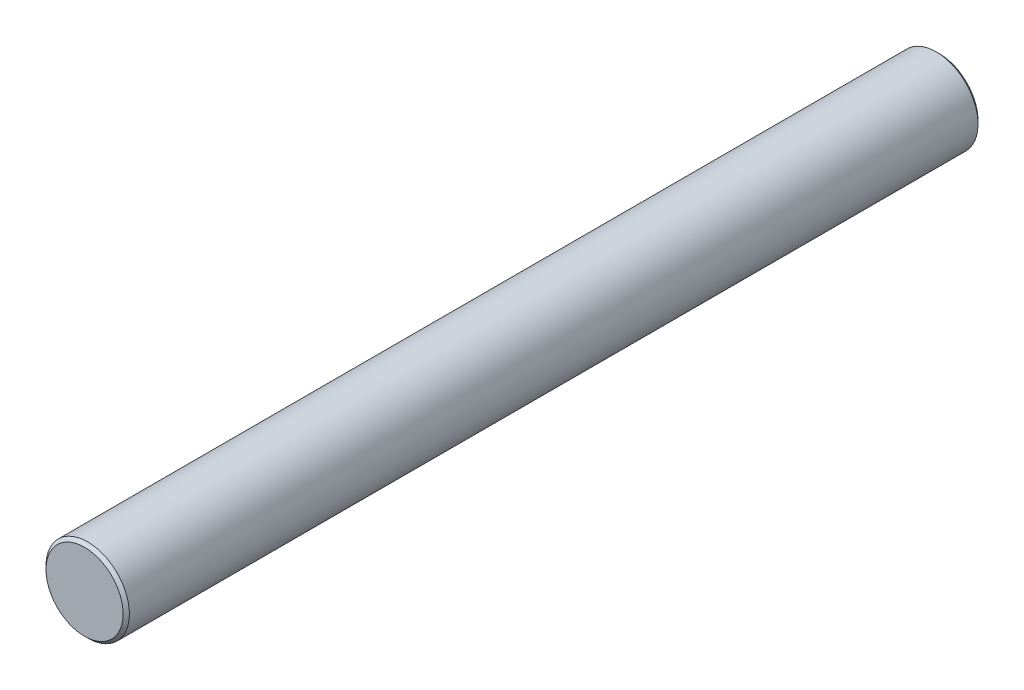
ISO-10303-21;
HEADER;
FILE_DESCRIPTION(('STEP AP214'),'2;1');
FILE_NAME('part.step','',(''),(''),'','','');
FILE_SCHEMA(('AUTOMOTIVE_DESIGN { 1 0 10303 214 1 1 1 1 }'));
ENDSEC;
DATA;
#1=APPLICATION_CONTEXT('core data for automotive mechanical design processes');
#2=APPLICATION_PROTOCOL_DEFINITION('international standard','automotive_design',2000,#1);
#3=PRODUCT_CONTEXT('',#1,'mechanical');
#4=PRODUCT('Part','Part','',(#3));
#5=PRODUCT_RELATED_PRODUCT_CATEGORY('part','',(#4));
#6=PRODUCT_DEFINITION_FORMATION('','',#4);
#7=PRODUCT_DEFINITION_CONTEXT('part definition',#1,'design');
#8=PRODUCT_DEFINITION('design','',#6,#7);
#9=PRODUCT_DEFINITION_SHAPE('','',#8);
#10=(LENGTH_UNIT() NAMED_UNIT(*) SI_UNIT(.MILLI.,.METRE.));
#11=(NAMED_UNIT(*) PLANE_ANGLE_UNIT() SI_UNIT($,.RADIAN.));
#12=(NAMED_UNIT(*) SI_UNIT($,.STERADIAN.) SOLID_ANGLE_UNIT());
#13=UNCERTAINTY_MEASURE_WITH_UNIT(LENGTH_MEASURE(1.E-05),#10,'distance_accuracy_value','');
#14=(GEOMETRIC_REPRESENTATION_CONTEXT(3) GLOBAL_UNCERTAINTY_ASSIGNED_CONTEXT((#13)) GLOBAL_UNIT_ASSIGNED_CONTEXT((#10,
#11,#12)) REPRESENTATION_CONTEXT('',''));
#15=CARTESIAN_POINT('',(0.,0.,0.));
#16=DIRECTION('',(0.,0.,1.));
#17=DIRECTION('',(1.,0.,0.));
#18=AXIS2_PLACEMENT_3D('',#15,#16,#17);
#19=CARTESIAN_POINT('',(0.,9.25,0.));
#20=DIRECTION('',(0.,0.,-1.));
#21=DIRECTION('',(0.,1.,0.));
#22=AXIS2_PLACEMENT_3D('',#19,#20,#21);
#23=PLANE('',#22);
#24=CARTESIAN_POINT('',(0.,0.,0.));
#25=DIRECTION('',(0.,0.,-1.));
#26=DIRECTION('',(0.,1.,0.));
#27=AXIS2_PLACEMENT_3D('',#24,#25,#26);
#28=CIRCLE('',#27,18.5);
#29=CARTESIAN_POINT('',(0.,18.5,0.));
#30=VERTEX_POINT('',#29);
#31=EDGE_CURVE('E9',#30,#30,#28,.T.);
#32=ORIENTED_EDGE('',*,*,#31,.T.);
#33=EDGE_LOOP('',(#32));
#34=FACE_BOUND('',#33,.T.);
#35=CARTESIAN_POINT('',(0.,0.,0.));
#36=DIRECTION('',(0.,0.,1.));
#37=DIRECTION('',(-1.,0.,0.));
#38=AXIS2_PLACEMENT_3D('',#35,#36,#37);
#39=CIRCLE('',#38,6.);
#40=CARTESIAN_POINT('',(-6.,0.,0.));
#41=VERTEX_POINT('',#40);
#42=EDGE_CURVE('E52',#41,#41,#39,.T.);
#43=ORIENTED_EDGE('',*,*,#42,.T.);
#44=EDGE_LOOP('',(#43));
#45=FACE_BOUND('',#44,.T.);
#46=ADVANCED_FACE('F15',(#34,#45),#23,.T.);
#47=CARTESIAN_POINT('',(0.,0.,0.75));
#48=DIRECTION('',(0.,0.,1.));
#49=DIRECTION('',(0.,1.,0.));
#50=AXIS2_PLACEMENT_3D('',#47,#48,#49);
#51=CONICAL_SURFACE('',#50,19.25,0.785398163397448);
#52=CARTESIAN_POINT('',(0.,0.,1.5));
#53=DIRECTION('',(0.,0.,-1.));
#54=DIRECTION('',(0.,1.,0.));
#55=AXIS2_PLACEMENT_3D('',#52,#53,#54);
#56=CIRCLE('',#55,20.);
#57=CARTESIAN_POINT('',(0.,20.,1.5));
#58=VERTEX_POINT('',#57);
#59=EDGE_CURVE('E25',#58,#58,#56,.T.);
#60=ORIENTED_EDGE('',*,*,#59,.T.);
#61=EDGE_LOOP('',(#60));
#62=FACE_BOUND('',#61,.T.);
#63=ORIENTED_EDGE('',*,*,#31,.F.);
#64=EDGE_LOOP('',(#63));
#65=FACE_BOUND('',#64,.T.);
#66=ADVANCED_FACE('F121',(#62,#65),#51,.T.);
#67=CARTESIAN_POINT('',(0.,0.,205.));
#68=DIRECTION('',(0.,0.,1.));
#69=DIRECTION('',(0.,1.,0.));
#70=AXIS2_PLACEMENT_3D('',#67,#68,#69);
#71=CYLINDRICAL_SURFACE('',#70,20.);
#72=CARTESIAN_POINT('',(0.,0.,408.5));
#73=DIRECTION('',(0.,0.,-1.));
#74=DIRECTION('',(0.,1.,0.));
#75=AXIS2_PLACEMENT_3D('',#72,#73,#74);
#76=CIRCLE('',#75,20.);
#77=CARTESIAN_POINT('',(0.,20.,408.5));
#78=VERTEX_POINT('',#77);
#79=EDGE_CURVE('E19',#78,#78,#76,.T.);
#80=ORIENTED_EDGE('',*,*,#79,.T.);
#81=EDGE_LOOP('',(#80));
#82=FACE_BOUND('',#81,.T.);
#83=ORIENTED_EDGE('',*,*,#59,.F.);
#84=EDGE_LOOP('',(#83));
#85=FACE_BOUND('',#84,.T.);
#86=CARTESIAN_POINT('',(0.,0.,6.5));
#87=DIRECTION('',(0.,0.,-1.));
#88=DIRECTION('',(0.,1.,0.));
#89=AXIS2_PLACEMENT_3D('',#86,#87,#88);
#90=CIRCLE('',#89,20.);
#91=CARTESIAN_POINT('',(10.5356537528527,-17.,6.5));
#92=VERTEX_POINT('',#91);
#93=CARTESIAN_POINT('',(-10.5356537528527,-17.,6.5));
#94=VERTEX_POINT('',#93);
#95=EDGE_CURVE('E69',#92,#94,#90,.T.);
#96=ORIENTED_EDGE('',*,*,#95,.T.);
#97=DIRECTION('',(0.,0.,1.));
#98=VECTOR('',#97,1.);
#99=CARTESIAN_POINT('',(-10.5356537528527,-17.,8.25));
#100=LINE('',#99,#98);
#101=CARTESIAN_POINT('',(-10.5356537528527,-17.,10.));
#102=VERTEX_POINT('',#101);
#103=EDGE_CURVE('E62',#94,#102,#100,.T.);
#104=ORIENTED_EDGE('',*,*,#103,.T.);
#105=CARTESIAN_POINT('',(0.,0.,10.));
#106=DIRECTION('',(0.,0.,1.));
#107=DIRECTION('',(0.,1.,0.));
#108=AXIS2_PLACEMENT_3D('',#105,#106,#107);
#109=CIRCLE('',#108,20.);
#110=CARTESIAN_POINT('',(10.5356537528527,-17.,10.));
#111=VERTEX_POINT('',#110);
#112=EDGE_CURVE('E75',#102,#111,#109,.T.);
#113=ORIENTED_EDGE('',*,*,#112,.T.);
#114=DIRECTION('',(0.,0.,-1.));
#115=VECTOR('',#114,1.);
#116=CARTESIAN_POINT('',(10.5356537528527,-17.,8.25));
#117=LINE('',#116,#115);
#118=EDGE_CURVE('E60',#111,#92,#117,.T.);
#119=ORIENTED_EDGE('',*,*,#118,.T.);
#120=EDGE_LOOP('',(#96,#104,#113,#119));
#121=FACE_BOUND('',#120,.T.);
#122=ADVANCED_FACE('F17',(#82,#85,#121),#71,.T.);
#123=CARTESIAN_POINT('',(0.,0.,409.25));
#124=DIRECTION('',(0.,0.,-1.));
#125=DIRECTION('',(0.,1.,0.));
#126=AXIS2_PLACEMENT_3D('',#123,#124,#125);
#127=CONICAL_SURFACE('',#126,19.25,0.785398163397448);
#128=CARTESIAN_POINT('',(0.,0.,410.));
#129=DIRECTION('',(0.,0.,-1.));
#130=DIRECTION('',(0.,1.,0.));
#131=AXIS2_PLACEMENT_3D('',#128,#129,#130);
#132=CIRCLE('',#131,18.5);
#133=CARTESIAN_POINT('',(0.,18.5,410.));
#134=VERTEX_POINT('',#133);
#135=EDGE_CURVE('E44',#134,#134,#132,.T.);
#136=ORIENTED_EDGE('',*,*,#135,.T.);
#137=EDGE_LOOP('',(#136));
#138=FACE_BOUND('',#137,.T.);
#139=ORIENTED_EDGE('',*,*,#79,.F.);
#140=EDGE_LOOP('',(#139));
#141=FACE_BOUND('',#140,.T.);
#142=ADVANCED_FACE('F116',(#138,#141),#127,.T.);
#143=CARTESIAN_POINT('',(0.,9.25,410.));
#144=DIRECTION('',(0.,0.,1.));
#145=DIRECTION('',(0.,-1.,0.));
#146=AXIS2_PLACEMENT_3D('',#143,#144,#145);
#147=PLANE('',#146);
#148=ORIENTED_EDGE('',*,*,#135,.F.);
#149=EDGE_LOOP('',(#148));
#150=FACE_BOUND('',#149,.T.);
#151=ADVANCED_FACE('F110',(#150),#147,.T.);
#152=CARTESIAN_POINT('',(0.,0.,26.4586213285198));
#153=DIRECTION('',(0.,0.,-1.));
#154=DIRECTION('',(-1.,0.,0.));
#155=AXIS2_PLACEMENT_3D('',#152,#153,#154);
#156=CONICAL_SURFACE('',#155,2.52640625,1.0471975511966);
#157=CARTESIAN_POINT('',(0.,0.,25.));
#158=DIRECTION('',(0.,0.,1.));
#159=DIRECTION('',(-1.,0.,0.));
#160=AXIS2_PLACEMENT_3D('',#157,#158,#159);
#161=CIRCLE('',#160,5.0528125);
#162=CARTESIAN_POINT('',(-5.0528125,0.,25.));
#163=VERTEX_POINT('',#162);
#164=EDGE_CURVE('E51',#163,#163,#161,.T.);
#165=ORIENTED_EDGE('',*,*,#164,.F.);
#166=EDGE_LOOP('',(#165));
#167=FACE_BOUND('',#166,.T.);
#168=CARTESIAN_POINT('',(0.,0.,27.9172426570397));
#169=VERTEX_POINT('',#168);
#170=VERTEX_LOOP('',#169);
#171=FACE_BOUND('',#170,.T.);
#172=ADVANCED_FACE('F104',(#167,#171),#156,.F.);
#173=CARTESIAN_POINT('',(0.,0.,12.97359375));
#174=DIRECTION('',(0.,0.,-1.));
#175=DIRECTION('',(-1.,0.,0.));
#176=AXIS2_PLACEMENT_3D('',#173,#174,#175);
#177=CYLINDRICAL_SURFACE('',#176,5.0528125);
#178=CARTESIAN_POINT('',(0.,0.,0.9471875));
#179=DIRECTION('',(0.,0.,1.));
#180=DIRECTION('',(-1.,0.,0.));
#181=AXIS2_PLACEMENT_3D('',#178,#179,#180);
#182=CIRCLE('',#181,5.0528125);
#183=CARTESIAN_POINT('',(-5.0528125,0.,0.9471875));
#184=VERTEX_POINT('',#183);
#185=EDGE_CURVE('E57',#184,#184,#182,.T.);
#186=ORIENTED_EDGE('',*,*,#185,.F.);
#187=EDGE_LOOP('',(#186));
#188=FACE_BOUND('',#187,.T.);
#189=ORIENTED_EDGE('',*,*,#164,.T.);
#190=EDGE_LOOP('',(#189));
#191=FACE_BOUND('',#190,.T.);
#192=ADVANCED_FACE('F101',(#188,#191),#177,.F.);
#193=CARTESIAN_POINT('',(0.,0.,0.47359375));
#194=DIRECTION('',(0.,0.,-1.));
#195=DIRECTION('',(-1.,0.,0.));
#196=AXIS2_PLACEMENT_3D('',#193,#194,#195);
#197=CONICAL_SURFACE('',#196,5.52640625,0.785398163397448);
#198=ORIENTED_EDGE('',*,*,#42,.F.);
#199=EDGE_LOOP('',(#198));
#200=FACE_BOUND('',#199,.T.);
#201=ORIENTED_EDGE('',*,*,#185,.T.);
#202=EDGE_LOOP('',(#201));
#203=FACE_BOUND('',#202,.T.);
#204=ADVANCED_FACE('F99',(#200,#203),#197,.F.);
#205=CARTESIAN_POINT('',(0.,-17.,8.25));
#206=DIRECTION('',(0.,-1.,0.));
#207=DIRECTION('',(0.,0.,-1.));
#208=AXIS2_PLACEMENT_3D('',#205,#206,#207);
#209=PLANE('',#208);
#210=ORIENTED_EDGE('',*,*,#103,.F.);
#211=DIRECTION('',(1.,0.,0.));
#212=VECTOR('',#211,1.);
#213=CARTESIAN_POINT('',(0.,-17.,6.5));
#214=LINE('',#213,#212);
#215=EDGE_CURVE('E66',#94,#92,#214,.T.);
#216=ORIENTED_EDGE('',*,*,#215,.T.);
#217=ORIENTED_EDGE('',*,*,#118,.F.);
#218=DIRECTION('',(-1.,0.,0.));
#219=VECTOR('',#218,1.);
#220=CARTESIAN_POINT('',(0.,-17.,10.));
#221=LINE('',#220,#219);
#222=EDGE_CURVE('E72',#111,#102,#221,.T.);
#223=ORIENTED_EDGE('',*,*,#222,.T.);
#224=EDGE_LOOP('',(#210,#216,#217,#223));
#225=FACE_BOUND('',#224,.T.);
#226=ADVANCED_FACE('F131',(#225),#209,.T.);
#227=CARTESIAN_POINT('',(0.,-19.5,6.5));
#228=DIRECTION('',(0.,0.,1.));
#229=DIRECTION('',(1.,0.,0.));
#230=AXIS2_PLACEMENT_3D('',#227,#228,#229);
#231=PLANE('',#230);
#232=ORIENTED_EDGE('',*,*,#95,.F.);
#233=ORIENTED_EDGE('',*,*,#215,.F.);
#234=EDGE_LOOP('',(#232,#233));
#235=FACE_BOUND('',#234,.T.);
#236=ADVANCED_FACE('F135',(#235),#231,.T.);
#237=CARTESIAN_POINT('',(0.,-19.5,10.));
#238=DIRECTION('',(0.,0.,1.));
#239=DIRECTION('',(1.,0.,0.));
#240=AXIS2_PLACEMENT_3D('',#237,#238,#239);
#241=PLANE('',#240);
#242=ORIENTED_EDGE('',*,*,#112,.F.);
#243=ORIENTED_EDGE('',*,*,#222,.F.);
#244=EDGE_LOOP('',(#242,#243));
#245=FACE_BOUND('',#244,.T.);
#246=ADVANCED_FACE('F87',(#245),#241,.F.);
#247=CLOSED_SHELL('',(#46,#66,#122,#142,#151,#172,#192,#204,#226,#236,#246));
#248=MANIFOLD_SOLID_BREP('B1',#247);
#249=ADVANCED_BREP_SHAPE_REPRESENTATION('',(#18,#248),#14);
#250=SHAPE_DEFINITION_REPRESENTATION(#9,#249);
ENDSEC;
END-ISO-10303-21;
